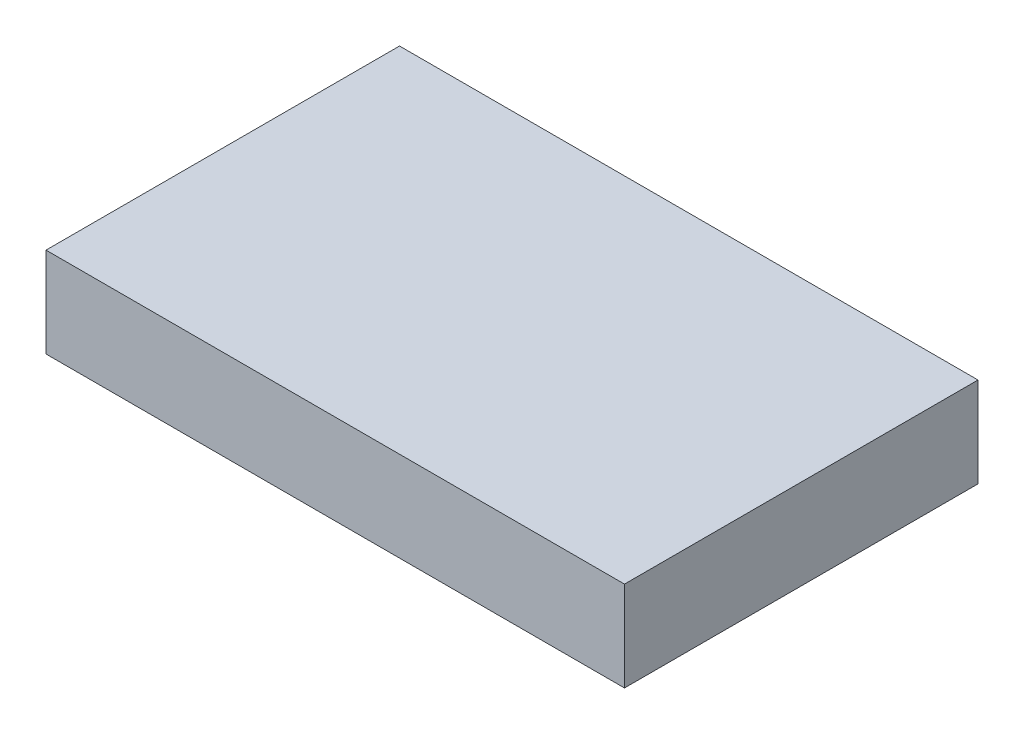
ISO-10303-21;
HEADER;
FILE_DESCRIPTION(('STEP AP214'),'2;1');
FILE_NAME('part.step','',(''),(''),'','','');
FILE_SCHEMA(('AUTOMOTIVE_DESIGN { 1 0 10303 214 1 1 1 1 }'));
ENDSEC;
DATA;
#1=APPLICATION_CONTEXT('core data for automotive mechanical design processes');
#2=APPLICATION_PROTOCOL_DEFINITION('international standard','automotive_design',2000,#1);
#3=PRODUCT_CONTEXT('',#1,'mechanical');
#4=PRODUCT('Part','Part','',(#3));
#5=PRODUCT_RELATED_PRODUCT_CATEGORY('part','',(#4));
#6=PRODUCT_DEFINITION_FORMATION('','',#4);
#7=PRODUCT_DEFINITION_CONTEXT('part definition',#1,'design');
#8=PRODUCT_DEFINITION('design','',#6,#7);
#9=PRODUCT_DEFINITION_SHAPE('','',#8);
#10=(LENGTH_UNIT() NAMED_UNIT(*) SI_UNIT(.MILLI.,.METRE.));
#11=(NAMED_UNIT(*) PLANE_ANGLE_UNIT() SI_UNIT($,.RADIAN.));
#12=(NAMED_UNIT(*) SI_UNIT($,.STERADIAN.) SOLID_ANGLE_UNIT());
#13=UNCERTAINTY_MEASURE_WITH_UNIT(LENGTH_MEASURE(1.E-05),#10,'distance_accuracy_value','');
#14=(GEOMETRIC_REPRESENTATION_CONTEXT(3) GLOBAL_UNCERTAINTY_ASSIGNED_CONTEXT((#13)) GLOBAL_UNIT_ASSIGNED_CONTEXT((#10,
#11,#12)) REPRESENTATION_CONTEXT('',''));
#15=CARTESIAN_POINT('',(0.,0.,0.));
#16=DIRECTION('',(0.,0.,1.));
#17=DIRECTION('',(1.,0.,0.));
#18=AXIS2_PLACEMENT_3D('',#15,#16,#17);
#19=CARTESIAN_POINT('',(45.,14.,55.));
#20=DIRECTION('',(-1.,0.,0.));
#21=DIRECTION('',(0.,0.,1.));
#22=AXIS2_PLACEMENT_3D('',#19,#20,#21);
#23=PLANE('',#22);
#24=DIRECTION('',(0.,1.,0.));
#25=VECTOR('',#24,1.);
#26=CARTESIAN_POINT('',(45.,14.,0.));
#27=LINE('',#26,#25);
#28=CARTESIAN_POINT('',(45.,0.,0.));
#29=VERTEX_POINT('',#28);
#30=CARTESIAN_POINT('',(45.,14.,0.));
#31=VERTEX_POINT('',#30);
#32=EDGE_CURVE('E113',#29,#31,#27,.T.);
#33=ORIENTED_EDGE('',*,*,#32,.T.);
#34=DIRECTION('',(0.,0.,-1.));
#35=VECTOR('',#34,1.);
#36=CARTESIAN_POINT('',(45.,14.,55.));
#37=LINE('',#36,#35);
#38=CARTESIAN_POINT('',(45.,14.,55.));
#39=VERTEX_POINT('',#38);
#40=EDGE_CURVE('E11',#39,#31,#37,.T.);
#41=ORIENTED_EDGE('',*,*,#40,.F.);
#42=DIRECTION('',(0.,1.,0.));
#43=VECTOR('',#42,1.);
#44=CARTESIAN_POINT('',(45.,14.,55.));
#45=LINE('',#44,#43);
#46=CARTESIAN_POINT('',(45.,0.,55.));
#47=VERTEX_POINT('',#46);
#48=EDGE_CURVE('E97',#47,#39,#45,.T.);
#49=ORIENTED_EDGE('',*,*,#48,.F.);
#50=DIRECTION('',(0.,0.,-1.));
#51=VECTOR('',#50,1.);
#52=CARTESIAN_POINT('',(45.,0.,55.));
#53=LINE('',#52,#51);
#54=EDGE_CURVE('E109',#47,#29,#53,.T.);
#55=ORIENTED_EDGE('',*,*,#54,.T.);
#56=EDGE_LOOP('',(#33,#41,#49,#55));
#57=FACE_BOUND('',#56,.T.);
#58=ADVANCED_FACE('F45',(#57),#23,.F.);
#59=CARTESIAN_POINT('',(-45.,14.,55.));
#60=DIRECTION('',(0.,-1.,0.));
#61=DIRECTION('',(1.,0.,0.));
#62=AXIS2_PLACEMENT_3D('',#59,#60,#61);
#63=PLANE('',#62);
#64=DIRECTION('',(-1.,0.,0.));
#65=VECTOR('',#64,1.);
#66=CARTESIAN_POINT('',(-45.,14.,0.));
#67=LINE('',#66,#65);
#68=CARTESIAN_POINT('',(-45.,14.,0.));
#69=VERTEX_POINT('',#68);
#70=EDGE_CURVE('E102',#31,#69,#67,.T.);
#71=ORIENTED_EDGE('',*,*,#70,.T.);
#72=DIRECTION('',(0.,0.,-1.));
#73=VECTOR('',#72,1.);
#74=CARTESIAN_POINT('',(-45.,14.,55.));
#75=LINE('',#74,#73);
#76=CARTESIAN_POINT('',(-45.,14.,55.));
#77=VERTEX_POINT('',#76);
#78=EDGE_CURVE('E54',#77,#69,#75,.T.);
#79=ORIENTED_EDGE('',*,*,#78,.F.);
#80=DIRECTION('',(-1.,0.,0.));
#81=VECTOR('',#80,1.);
#82=CARTESIAN_POINT('',(-45.,14.,55.));
#83=LINE('',#82,#81);
#84=EDGE_CURVE('E92',#39,#77,#83,.T.);
#85=ORIENTED_EDGE('',*,*,#84,.F.);
#86=ORIENTED_EDGE('',*,*,#40,.T.);
#87=EDGE_LOOP('',(#71,#79,#85,#86));
#88=FACE_BOUND('',#87,.T.);
#89=ADVANCED_FACE('F101',(#88),#63,.F.);
#90=CARTESIAN_POINT('',(-45.,0.,55.));
#91=DIRECTION('',(1.,0.,0.));
#92=DIRECTION('',(0.,0.,-1.));
#93=AXIS2_PLACEMENT_3D('',#90,#91,#92);
#94=PLANE('',#93);
#95=DIRECTION('',(0.,-1.,0.));
#96=VECTOR('',#95,1.);
#97=CARTESIAN_POINT('',(-45.,0.,0.));
#98=LINE('',#97,#96);
#99=CARTESIAN_POINT('',(-45.,0.,0.));
#100=VERTEX_POINT('',#99);
#101=EDGE_CURVE('E79',#69,#100,#98,.T.);
#102=ORIENTED_EDGE('',*,*,#101,.T.);
#103=DIRECTION('',(0.,0.,-1.));
#104=VECTOR('',#103,1.);
#105=CARTESIAN_POINT('',(-45.,0.,55.));
#106=LINE('',#105,#104);
#107=CARTESIAN_POINT('',(-45.,0.,55.));
#108=VERTEX_POINT('',#107);
#109=EDGE_CURVE('E104',#108,#100,#106,.T.);
#110=ORIENTED_EDGE('',*,*,#109,.F.);
#111=DIRECTION('',(0.,-1.,0.));
#112=VECTOR('',#111,1.);
#113=CARTESIAN_POINT('',(-45.,0.,55.));
#114=LINE('',#113,#112);
#115=EDGE_CURVE('E95',#77,#108,#114,.T.);
#116=ORIENTED_EDGE('',*,*,#115,.F.);
#117=ORIENTED_EDGE('',*,*,#78,.T.);
#118=EDGE_LOOP('',(#102,#110,#116,#117));
#119=FACE_BOUND('',#118,.T.);
#120=ADVANCED_FACE('F105',(#119),#94,.F.);
#121=CARTESIAN_POINT('',(-45.,0.,55.));
#122=DIRECTION('',(0.,1.,0.));
#123=DIRECTION('',(-1.,0.,0.));
#124=AXIS2_PLACEMENT_3D('',#121,#122,#123);
#125=PLANE('',#124);
#126=DIRECTION('',(1.,0.,0.));
#127=VECTOR('',#126,1.);
#128=CARTESIAN_POINT('',(-45.,0.,0.));
#129=LINE('',#128,#127);
#130=EDGE_CURVE('E85',#100,#29,#129,.T.);
#131=ORIENTED_EDGE('',*,*,#130,.T.);
#132=ORIENTED_EDGE('',*,*,#54,.F.);
#133=DIRECTION('',(1.,0.,0.));
#134=VECTOR('',#133,1.);
#135=CARTESIAN_POINT('',(-45.,0.,55.));
#136=LINE('',#135,#134);
#137=EDGE_CURVE('E62',#108,#47,#136,.T.);
#138=ORIENTED_EDGE('',*,*,#137,.F.);
#139=ORIENTED_EDGE('',*,*,#109,.T.);
#140=EDGE_LOOP('',(#131,#132,#138,#139));
#141=FACE_BOUND('',#140,.T.);
#142=ADVANCED_FACE('F126',(#141),#125,.F.);
#143=CARTESIAN_POINT('',(0.,0.,55.));
#144=DIRECTION('',(0.,0.,1.));
#145=DIRECTION('',(1.,0.,0.));
#146=AXIS2_PLACEMENT_3D('',#143,#144,#145);
#147=PLANE('',#146);
#148=ORIENTED_EDGE('',*,*,#48,.T.);
#149=ORIENTED_EDGE('',*,*,#84,.T.);
#150=ORIENTED_EDGE('',*,*,#115,.T.);
#151=ORIENTED_EDGE('',*,*,#137,.T.);
#152=EDGE_LOOP('',(#148,#149,#150,#151));
#153=FACE_BOUND('',#152,.T.);
#154=ADVANCED_FACE('F93',(#153),#147,.T.);
#155=CARTESIAN_POINT('',(0.,0.,0.));
#156=DIRECTION('',(0.,0.,1.));
#157=DIRECTION('',(1.,0.,0.));
#158=AXIS2_PLACEMENT_3D('',#155,#156,#157);
#159=PLANE('',#158);
#160=ORIENTED_EDGE('',*,*,#32,.F.);
#161=ORIENTED_EDGE('',*,*,#130,.F.);
#162=ORIENTED_EDGE('',*,*,#101,.F.);
#163=ORIENTED_EDGE('',*,*,#70,.F.);
#164=EDGE_LOOP('',(#160,#161,#162,#163));
#165=FACE_BOUND('',#164,.T.);
#166=ADVANCED_FACE('F129',(#165),#159,.F.);
#167=CLOSED_SHELL('',(#58,#89,#120,#142,#154,#166));
#168=MANIFOLD_SOLID_BREP('B2',#167);
#169=ADVANCED_BREP_SHAPE_REPRESENTATION('',(#18,#168),#14);
#170=SHAPE_DEFINITION_REPRESENTATION(#9,#169);
ENDSEC;
END-ISO-10303-21;
